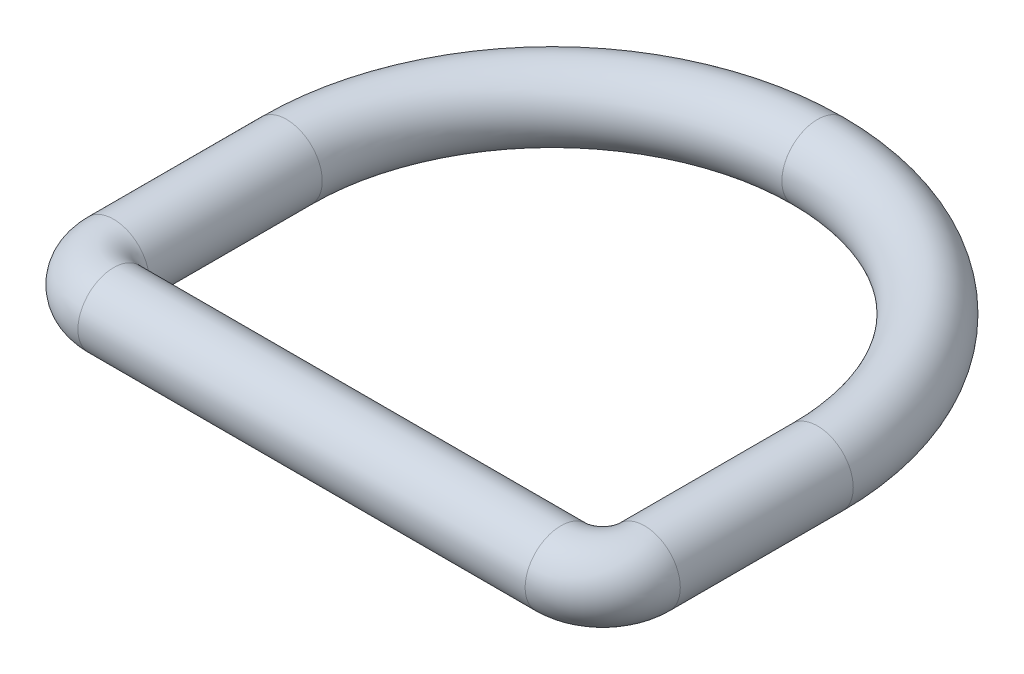
ISO-10303-21;
HEADER;
FILE_DESCRIPTION(('STEP AP214'),'2;1');
FILE_NAME('part.step','',(''),(''),'','','');
FILE_SCHEMA(('AUTOMOTIVE_DESIGN { 1 0 10303 214 1 1 1 1 }'));
ENDSEC;
DATA;
#1=APPLICATION_CONTEXT('core data for automotive mechanical design processes');
#2=APPLICATION_PROTOCOL_DEFINITION('international standard','automotive_design',2000,#1);
#3=PRODUCT_CONTEXT('',#1,'mechanical');
#4=PRODUCT('Part','Part','',(#3));
#5=PRODUCT_RELATED_PRODUCT_CATEGORY('part','',(#4));
#6=PRODUCT_DEFINITION_FORMATION('','',#4);
#7=PRODUCT_DEFINITION_CONTEXT('part definition',#1,'design');
#8=PRODUCT_DEFINITION('design','',#6,#7);
#9=PRODUCT_DEFINITION_SHAPE('','',#8);
#10=(LENGTH_UNIT() NAMED_UNIT(*) SI_UNIT(.MILLI.,.METRE.));
#11=(NAMED_UNIT(*) PLANE_ANGLE_UNIT() SI_UNIT($,.RADIAN.));
#12=(NAMED_UNIT(*) SI_UNIT($,.STERADIAN.) SOLID_ANGLE_UNIT());
#13=UNCERTAINTY_MEASURE_WITH_UNIT(LENGTH_MEASURE(1.E-05),#10,'distance_accuracy_value','');
#14=(GEOMETRIC_REPRESENTATION_CONTEXT(3) GLOBAL_UNCERTAINTY_ASSIGNED_CONTEXT((#13)) GLOBAL_UNIT_ASSIGNED_CONTEXT((#10,
#11,#12)) REPRESENTATION_CONTEXT('',''));
#15=CARTESIAN_POINT('',(0.,0.,0.));
#16=DIRECTION('',(0.,0.,1.));
#17=DIRECTION('',(1.,0.,0.));
#18=AXIS2_PLACEMENT_3D('',#15,#16,#17);
#19=CARTESIAN_POINT('',(-3.40836581343383,-9.71495477391288,-11.6115349304083));
#20=DIRECTION('',(0.,-1.,0.));
#21=DIRECTION('',(0.,0.,-1.));
#22=AXIS2_PLACEMENT_3D('',#19,#20,#21);
#23=TOROIDAL_SURFACE('',#22,3.175,2.7051);
#24=CARTESIAN_POINT('',(-0.233365813433827,-9.71495477391288,-11.6115349304083));
#25=DIRECTION('',(0.,0.,-1.));
#26=DIRECTION('',(-1.,0.,0.));
#27=AXIS2_PLACEMENT_3D('',#24,#25,#26);
#28=CIRCLE('',#27,2.7051);
#29=CARTESIAN_POINT('',(2.47173418656617,-9.71495477391288,-11.6115349304083));
#30=VERTEX_POINT('',#29);
#31=EDGE_CURVE('E24',#30,#30,#28,.T.);
#32=ORIENTED_EDGE('',*,*,#31,.F.);
#33=EDGE_LOOP('',(#32));
#34=FACE_BOUND('',#33,.T.);
#35=CARTESIAN_POINT('',(-3.40836581343383,-9.71495477391288,-11.1416349304083));
#36=CARTESIAN_POINT('',(-3.40836581343383,-9.67069263396935,-11.1416358693182));
#37=CARTESIAN_POINT('',(-3.40836581343383,-9.62643057391784,-11.1405486085736));
#38=CARTESIAN_POINT('',(-3.40836581343383,-9.53801304226172,-11.1362044294043));
#39=CARTESIAN_POINT('',(-3.40836581343383,-9.49385757065712,-11.1329475109796));
#40=CARTESIAN_POINT('',(-3.40836581343383,-9.40575964455766,-11.1242707580789));
#41=CARTESIAN_POINT('',(-3.40836581343383,-9.3618171900628,-11.118850923603));
#42=CARTESIAN_POINT('',(-3.40836581343383,-9.27425114486457,-11.1058616914251));
#43=CARTESIAN_POINT('',(-3.40836581343383,-9.23062755416119,-11.0982922937233));
#44=CARTESIAN_POINT('',(-3.40836581343383,-9.14380433349291,-11.0810220911309));
#45=CARTESIAN_POINT('',(-3.40836581343384,-9.100604703528,-11.0713212862405));
#46=CARTESIAN_POINT('',(-3.40836581343384,-9.01473347498513,-11.0498116606093));
#47=CARTESIAN_POINT('',(-3.40836581343384,-8.97206187640717,-11.0380028398686));
#48=CARTESIAN_POINT('',(-3.40836581343384,-8.8873495105365,-11.0123056253265));
#49=CARTESIAN_POINT('',(-3.40836581343384,-8.84530874324378,-10.9984172315251));
#50=CARTESIAN_POINT('',(-3.40836581343384,-8.76195931975939,-10.9685943307447));
#51=CARTESIAN_POINT('',(-3.40836581343384,-8.72065066356771,-10.9526598237655));
#52=CARTESIAN_POINT('',(-3.40836581343384,-8.63886497847644,-10.9187830838437));
#53=CARTESIAN_POINT('',(-3.40836581343384,-8.59838794957686,-10.9008408509009));
#54=CARTESIAN_POINT('',(-3.40836581343384,-8.51836303177239,-10.8629918835722));
#55=CARTESIAN_POINT('',(-3.40836581343384,-8.47881514286751,-10.8430851491861));
#56=CARTESIAN_POINT('',(-3.40836581343384,-8.40074377938224,-10.801355136008));
#57=CARTESIAN_POINT('',(-3.40836581343384,-8.36222030480186,-10.779531857216));
#58=CARTESIAN_POINT('',(-3.40836581343384,-8.28629057638973,-10.7340213294241));
#59=CARTESIAN_POINT('',(-3.40836581343384,-8.24888432255799,-10.7103340804241));
#60=CARTESIAN_POINT('',(-3.40836581343384,-8.17527915058512,-10.6611526768717));
#61=CARTESIAN_POINT('',(-3.40836581343384,-8.139080232444,-10.6356585223193));
#62=CARTESIAN_POINT('',(-3.40836581343384,-8.0679769382168,-10.5829247253139));
#63=CARTESIAN_POINT('',(-3.40836581343384,-8.03307256213072,-10.5556850828609));
#64=CARTESIAN_POINT('',(-3.40836581343384,-7.96464243971288,-10.4995259327388));
#65=CARTESIAN_POINT('',(-3.40836581343385,-7.93111669338111,-10.4706064250697));
#66=CARTESIAN_POINT('',(-3.40836581343385,-7.86552459693131,-10.4111572141424));
#67=CARTESIAN_POINT('',(-3.40836581343385,-7.83345824681327,-10.3806275108842));
#68=CARTESIAN_POINT('',(-3.40836581343385,-7.77086219343703,-10.3180314575079));
#69=CARTESIAN_POINT('',(-3.40836581343385,-7.74033249017884,-10.2859651073899));
#70=CARTESIAN_POINT('',(-3.40836581343385,-7.68088327925152,-10.2203730109401));
#71=CARTESIAN_POINT('',(-3.40836581343385,-7.65196377158241,-10.1868472646083));
#72=CARTESIAN_POINT('',(-3.40836581343385,-7.59580462146027,-10.1184171421905));
#73=CARTESIAN_POINT('',(-3.40836581343385,-7.56856497900726,-10.0835127661044));
#74=CARTESIAN_POINT('',(-3.40836581343385,-7.51583118200192,-10.0124094718772));
#75=CARTESIAN_POINT('',(-3.40836581343385,-7.49033702744958,-9.97621055373607));
#76=CARTESIAN_POINT('',(-3.40836581343385,-7.44115562389695,-9.90260538176322));
#77=CARTESIAN_POINT('',(-3.40836581343386,-7.41746837489664,-9.86519912793149));
#78=CARTESIAN_POINT('',(-3.40836581343386,-7.37195784710565,-9.78926939951932));
#79=CARTESIAN_POINT('',(-3.40836581343386,-7.35013456831497,-9.75074592493887));
#80=CARTESIAN_POINT('',(-3.40836581343386,-7.30840455513332,-9.67267456145378));
#81=CARTESIAN_POINT('',(-3.40836581343386,-7.28849782074237,-9.63312667254914));
#82=CARTESIAN_POINT('',(-3.40836581343386,-7.25064885342694,-9.55310175474401));
#83=CARTESIAN_POINT('',(-3.40836581343386,-7.23270662050248,-9.51262472584353));
#84=CARTESIAN_POINT('',(-3.40836581343386,-7.19882988053072,-9.43083904075472));
#85=CARTESIAN_POINT('',(-3.40836581343386,-7.18289537348342,-9.38953038456639));
#86=CARTESIAN_POINT('',(-3.40836581343387,-7.15307247288916,-9.30618096107284));
#87=CARTESIAN_POINT('',(-3.40836581343387,-7.1391840793422,-9.26414019376763));
#88=CARTESIAN_POINT('',(-3.40836581343387,-7.11348686410516,-9.1794278279311));
#89=CARTESIAN_POINT('',(-3.40836581343387,-7.10167804241508,-9.13675622939978));
#90=CARTESIAN_POINT('',(-3.40836581343387,-7.08016841937756,-9.0508850007295));
#91=CARTESIAN_POINT('',(-3.40836581343387,-7.07046761803013,-9.00768537059053));
#92=CARTESIAN_POINT('',(-3.40836581343387,-7.05319740575807,-8.92086215039777));
#93=CARTESIAN_POINT('',(-3.40836581343387,-7.04562799483343,-8.877238560344));
#94=CARTESIAN_POINT('',(-3.40836581343387,-7.03263879878087,-8.78967251337104));
#95=CARTESIAN_POINT('',(-3.40836581343387,-7.02721901365295,-8.74573005645187));
#96=CARTESIAN_POINT('',(-3.40836581343388,-7.0185421259309,-8.65763213697576));
#97=CARTESIAN_POINT('',(-3.40836581343388,-7.01528502333677,-8.61347667441881));
#98=CARTESIAN_POINT('',(-3.40836581343388,-7.01094134732777,-8.52505911804402));
#99=CARTESIAN_POINT('',(-3.40836581343388,-7.00985477391288,-8.48079702422617));
#100=CARTESIAN_POINT('',(-3.40836581343388,-7.00985477391288,-8.39227283659047));
#101=CARTESIAN_POINT('',(-3.40836581343388,-7.01094134732777,-8.34801074277262));
#102=CARTESIAN_POINT('',(-3.40836581343388,-7.01528502333677,-8.25959318639783));
#103=CARTESIAN_POINT('',(-3.40836581343388,-7.0185421259309,-8.21543772384088));
#104=CARTESIAN_POINT('',(-3.40836581343389,-7.02721901365295,-8.12733980436477));
#105=CARTESIAN_POINT('',(-3.40836581343389,-7.03263879878087,-8.0833973474456));
#106=CARTESIAN_POINT('',(-3.40836581343389,-7.04562799483343,-7.99583130047264));
#107=CARTESIAN_POINT('',(-3.40836581343389,-7.05319740575807,-7.95220771041887));
#108=CARTESIAN_POINT('',(-3.40836581343389,-7.07046761803013,-7.86538449022612));
#109=CARTESIAN_POINT('',(-3.40836581343389,-7.08016841937756,-7.82218486008714));
#110=CARTESIAN_POINT('',(-3.40836581343389,-7.10167804241508,-7.73631363141686));
#111=CARTESIAN_POINT('',(-3.40836581343389,-7.11348686410516,-7.69364203288554));
#112=CARTESIAN_POINT('',(-3.40836581343389,-7.1391840793422,-7.60892966704901));
#113=CARTESIAN_POINT('',(-3.40836581343389,-7.15307247288916,-7.5668888997438));
#114=CARTESIAN_POINT('',(-3.4083658134339,-7.18289537348342,-7.48353947625025));
#115=CARTESIAN_POINT('',(-3.4083658134339,-7.19882988053072,-7.44223082006192));
#116=CARTESIAN_POINT('',(-3.4083658134339,-7.23270662050248,-7.36044513497311));
#117=CARTESIAN_POINT('',(-3.4083658134339,-7.25064885342694,-7.31996810607263));
#118=CARTESIAN_POINT('',(-3.4083658134339,-7.28849782074237,-7.2399431882675));
#119=CARTESIAN_POINT('',(-3.4083658134339,-7.30840455513332,-7.20039529936286));
#120=CARTESIAN_POINT('',(-3.4083658134339,-7.35013456831497,-7.12232393587777));
#121=CARTESIAN_POINT('',(-3.4083658134339,-7.37195784710565,-7.08380046129732));
#122=CARTESIAN_POINT('',(-3.4083658134339,-7.41746837489664,-7.00787073288515));
#123=CARTESIAN_POINT('',(-3.4083658134339,-7.44115562389695,-6.97046447905342));
#124=CARTESIAN_POINT('',(-3.4083658134339,-7.49033702744959,-6.89685930708057));
#125=CARTESIAN_POINT('',(-3.40836581343391,-7.51583118200192,-6.86066038893944));
#126=CARTESIAN_POINT('',(-3.40836581343391,-7.56856497900726,-6.78955709471224));
#127=CARTESIAN_POINT('',(-3.40836581343391,-7.59580462146028,-6.75465271862616));
#128=CARTESIAN_POINT('',(-3.40836581343391,-7.65196377158241,-6.68622259620832));
#129=CARTESIAN_POINT('',(-3.40836581343391,-7.68088327925152,-6.65269684987655));
#130=CARTESIAN_POINT('',(-3.40836581343391,-7.74033249017884,-6.58710475342675));
#131=CARTESIAN_POINT('',(-3.40836581343391,-7.77086219343703,-6.55503840330871));
#132=CARTESIAN_POINT('',(-3.40836581343391,-7.83345824681327,-6.49244234993247));
#133=CARTESIAN_POINT('',(-3.40836581343391,-7.86552459693131,-6.46191264667428));
#134=CARTESIAN_POINT('',(-3.40836581343391,-7.93111669338111,-6.40246343574696));
#135=CARTESIAN_POINT('',(-3.40836581343392,-7.96464243971288,-6.37354392807785));
#136=CARTESIAN_POINT('',(-3.40836581343392,-8.03307256213072,-6.31738477795572));
#137=CARTESIAN_POINT('',(-3.40836581343392,-8.0679769382168,-6.2901451355027));
#138=CARTESIAN_POINT('',(-3.40836581343392,-8.139080232444,-6.23741133849736));
#139=CARTESIAN_POINT('',(-3.40836581343392,-8.17527915058513,-6.21191718394502));
#140=CARTESIAN_POINT('',(-3.40836581343392,-8.24888432255798,-6.16273578039239));
#141=CARTESIAN_POINT('',(-3.40836581343392,-8.28629057638971,-6.13904853139208));
#142=CARTESIAN_POINT('',(-3.40836581343392,-8.36222030480188,-6.09353800360109));
#143=CARTESIAN_POINT('',(-3.40836581343392,-8.40074377938233,-6.07171472481041));
#144=CARTESIAN_POINT('',(-3.40836581343392,-8.47881514286742,-6.02998471162876));
#145=CARTESIAN_POINT('',(-3.40836581343392,-8.51836303177206,-6.0100779772378));
#146=CARTESIAN_POINT('',(-3.40836581343392,-8.59838794957719,-5.97222900992238));
#147=CARTESIAN_POINT('',(-3.40836581343392,-8.63886497847767,-5.95428677699792));
#148=CARTESIAN_POINT('',(-3.40836581343392,-8.72065066356648,-5.92041003702616));
#149=CARTESIAN_POINT('',(-3.40836581343392,-8.76195931975482,-5.90447552997886));
#150=CARTESIAN_POINT('',(-3.40836581343392,-8.84530874324836,-5.8746526293846));
#151=CARTESIAN_POINT('',(-3.40836581343392,-8.88734951055357,-5.86076423583764));
#152=CARTESIAN_POINT('',(-3.40836581343393,-8.9720618763901,-5.8350670206006));
#153=CARTESIAN_POINT('',(-3.40836581343393,-9.01473347492142,-5.82325819891052));
#154=CARTESIAN_POINT('',(-3.40836581343393,-9.10060470359171,-5.801748575873));
#155=CARTESIAN_POINT('',(-3.40836581343393,-9.14380433373068,-5.79204777452557));
#156=CARTESIAN_POINT('',(-3.40836581343393,-9.23062755392343,-5.77477756225351));
#157=CARTESIAN_POINT('',(-3.40836581343393,-9.27425114397721,-5.76720815132887));
#158=CARTESIAN_POINT('',(-3.40836581343393,-9.36181719095016,-5.75421895527631));
#159=CARTESIAN_POINT('',(-3.40836581343393,-9.40575964786933,-5.74879917014839));
#160=CARTESIAN_POINT('',(-3.40836581343393,-9.49385756734544,-5.74012228242634));
#161=CARTESIAN_POINT('',(-3.40836581343393,-9.53801302990239,-5.73686517983221));
#162=CARTESIAN_POINT('',(-3.40836581343393,-9.62643058627718,-5.7325215038232));
#163=CARTESIAN_POINT('',(-3.40836581343393,-9.67069268009503,-5.73143493040832));
#164=CARTESIAN_POINT('',(-3.40836581343393,-9.75921686773073,-5.73143493040832));
#165=CARTESIAN_POINT('',(-3.40836581343393,-9.80347896154858,-5.7325215038232));
#166=CARTESIAN_POINT('',(-3.40836581343393,-9.89189651792338,-5.73686517983221));
#167=CARTESIAN_POINT('',(-3.40836581343393,-9.93605198048032,-5.74012228242634));
#168=CARTESIAN_POINT('',(-3.40836581343393,-10.0241498999564,-5.74879917014839));
#169=CARTESIAN_POINT('',(-3.40836581343393,-10.0680923568756,-5.75421895527631));
#170=CARTESIAN_POINT('',(-3.40836581343393,-10.1556584038486,-5.76720815132887));
#171=CARTESIAN_POINT('',(-3.40836581343393,-10.1992819939023,-5.77477756225351));
#172=CARTESIAN_POINT('',(-3.40836581343393,-10.2861052140951,-5.79204777452557));
#173=CARTESIAN_POINT('',(-3.40836581343393,-10.3293048442341,-5.801748575873));
#174=CARTESIAN_POINT('',(-3.40836581343393,-10.4151760729043,-5.82325819891052));
#175=CARTESIAN_POINT('',(-3.40836581343393,-10.4578476714357,-5.8350670206006));
#176=CARTESIAN_POINT('',(-3.40836581343392,-10.5425600372722,-5.86076423583764));
#177=CARTESIAN_POINT('',(-3.40836581343392,-10.5846008045774,-5.8746526293846));
#178=CARTESIAN_POINT('',(-3.40836581343392,-10.6679502280709,-5.90447552997886));
#179=CARTESIAN_POINT('',(-3.40836581343392,-10.7092588842593,-5.92041003702616));
#180=CARTESIAN_POINT('',(-3.40836581343392,-10.7910445693481,-5.95428677699792));
#181=CARTESIAN_POINT('',(-3.40836581343392,-10.8315215982486,-5.97222900992238));
#182=CARTESIAN_POINT('',(-3.40836581343392,-10.9115465160537,-6.0100779772378));
#183=CARTESIAN_POINT('',(-3.40836581343392,-10.9510944049583,-6.02998471162876));
#184=CARTESIAN_POINT('',(-3.40836581343392,-11.0291657684434,-6.07171472481041));
#185=CARTESIAN_POINT('',(-3.40836581343392,-11.0676892430239,-6.09353800360109));
#186=CARTESIAN_POINT('',(-3.40836581343392,-11.1436189714361,-6.13904853139208));
#187=CARTESIAN_POINT('',(-3.40836581343392,-11.1810252252678,-6.16273578039239));
#188=CARTESIAN_POINT('',(-3.40836581343392,-11.2546303972406,-6.21191718394502));
#189=CARTESIAN_POINT('',(-3.40836581343392,-11.2908293153818,-6.23741133849736));
#190=CARTESIAN_POINT('',(-3.40836581343392,-11.361932609609,-6.2901451355027));
#191=CARTESIAN_POINT('',(-3.40836581343392,-11.396836985695,-6.31738477795572));
#192=CARTESIAN_POINT('',(-3.40836581343392,-11.4652671081129,-6.37354392807785));
#193=CARTESIAN_POINT('',(-3.40836581343391,-11.4987928544446,-6.40246343574696));
#194=CARTESIAN_POINT('',(-3.40836581343391,-11.5643849508945,-6.46191264667428));
#195=CARTESIAN_POINT('',(-3.40836581343391,-11.5964513010125,-6.49244234993247));
#196=CARTESIAN_POINT('',(-3.40836581343391,-11.6590473543887,-6.55503840330871));
#197=CARTESIAN_POINT('',(-3.40836581343391,-11.6895770576469,-6.58710475342675));
#198=CARTESIAN_POINT('',(-3.40836581343391,-11.7490262685742,-6.65269684987655));
#199=CARTESIAN_POINT('',(-3.40836581343391,-11.7779457762434,-6.68622259620832));
#200=CARTESIAN_POINT('',(-3.40836581343391,-11.8341049263655,-6.75465271862616));
#201=CARTESIAN_POINT('',(-3.40836581343391,-11.8613445688185,-6.78955709471224));
#202=CARTESIAN_POINT('',(-3.40836581343391,-11.9140783658238,-6.86066038893944));
#203=CARTESIAN_POINT('',(-3.4083658134339,-11.9395725203762,-6.89685930708057));
#204=CARTESIAN_POINT('',(-3.4083658134339,-11.9887539239288,-6.97046447905342));
#205=CARTESIAN_POINT('',(-3.4083658134339,-12.0124411729291,-7.00787073288515));
#206=CARTESIAN_POINT('',(-3.4083658134339,-12.0579517007201,-7.08380046129732));
#207=CARTESIAN_POINT('',(-3.4083658134339,-12.0797749795108,-7.12232393587777));
#208=CARTESIAN_POINT('',(-3.4083658134339,-12.1215049926924,-7.20039529936286));
#209=CARTESIAN_POINT('',(-3.4083658134339,-12.1414117270834,-7.2399431882675));
#210=CARTESIAN_POINT('',(-3.4083658134339,-12.1792606943988,-7.31996810607263));
#211=CARTESIAN_POINT('',(-3.4083658134339,-12.1972029273233,-7.36044513497311));
#212=CARTESIAN_POINT('',(-3.4083658134339,-12.231079667295,-7.44223082006192));
#213=CARTESIAN_POINT('',(-3.4083658134339,-12.2470141743423,-7.48353947625025));
#214=CARTESIAN_POINT('',(-3.40836581343389,-12.2768370749366,-7.5668888997438));
#215=CARTESIAN_POINT('',(-3.40836581343389,-12.2907254684836,-7.60892966704901));
#216=CARTESIAN_POINT('',(-3.40836581343389,-12.3164226837206,-7.69364203288554));
#217=CARTESIAN_POINT('',(-3.40836581343389,-12.3282315054107,-7.73631363141686));
#218=CARTESIAN_POINT('',(-3.40836581343389,-12.3497411284482,-7.82218486008714));
#219=CARTESIAN_POINT('',(-3.40836581343389,-12.3594419297956,-7.86538449022612));
#220=CARTESIAN_POINT('',(-3.40836581343389,-12.3767121420677,-7.95220771041887));
#221=CARTESIAN_POINT('',(-3.40836581343389,-12.3842815529923,-7.99583130047264));
#222=CARTESIAN_POINT('',(-3.40836581343389,-12.3972707490449,-8.0833973474456));
#223=CARTESIAN_POINT('',(-3.40836581343389,-12.4026905341728,-8.12733980436477));
#224=CARTESIAN_POINT('',(-3.40836581343388,-12.4113674218949,-8.21543772384088));
#225=CARTESIAN_POINT('',(-3.40836581343388,-12.414624524489,-8.25959318639783));
#226=CARTESIAN_POINT('',(-3.40836581343388,-12.418968200498,-8.34801074277262));
#227=CARTESIAN_POINT('',(-3.40836581343388,-12.4200547739129,-8.39227283659047));
#228=CARTESIAN_POINT('',(-3.40836581343388,-12.4200547739129,-8.48079702422617));
#229=CARTESIAN_POINT('',(-3.40836581343388,-12.418968200498,-8.52505911804402));
#230=CARTESIAN_POINT('',(-3.40836581343388,-12.414624524489,-8.61347667441881));
#231=CARTESIAN_POINT('',(-3.40836581343388,-12.4113674218949,-8.65763213697576));
#232=CARTESIAN_POINT('',(-3.40836581343387,-12.4026905341728,-8.74573005645187));
#233=CARTESIAN_POINT('',(-3.40836581343387,-12.3972707490449,-8.78967251337104));
#234=CARTESIAN_POINT('',(-3.40836581343387,-12.3842815529923,-8.877238560344));
#235=CARTESIAN_POINT('',(-3.40836581343387,-12.3767121420677,-8.92086215039777));
#236=CARTESIAN_POINT('',(-3.40836581343387,-12.3594419297956,-9.00768537059053));
#237=CARTESIAN_POINT('',(-3.40836581343387,-12.3497411284482,-9.0508850007295));
#238=CARTESIAN_POINT('',(-3.40836581343387,-12.3282315054107,-9.13675622939978));
#239=CARTESIAN_POINT('',(-3.40836581343387,-12.3164226837206,-9.1794278279311));
#240=CARTESIAN_POINT('',(-3.40836581343387,-12.2907254684836,-9.26414019376763));
#241=CARTESIAN_POINT('',(-3.40836581343387,-12.2768370749366,-9.30618096107284));
#242=CARTESIAN_POINT('',(-3.40836581343386,-12.2470141743423,-9.38953038456639));
#243=CARTESIAN_POINT('',(-3.40836581343386,-12.231079667295,-9.43083904075472));
#244=CARTESIAN_POINT('',(-3.40836581343386,-12.1972029273233,-9.51262472584353));
#245=CARTESIAN_POINT('',(-3.40836581343386,-12.1792606943988,-9.55310175474401));
#246=CARTESIAN_POINT('',(-3.40836581343386,-12.1414117270834,-9.63312667254914));
#247=CARTESIAN_POINT('',(-3.40836581343386,-12.1215049926924,-9.67267456145378));
#248=CARTESIAN_POINT('',(-3.40836581343386,-12.0797749795108,-9.75074592493887));
#249=CARTESIAN_POINT('',(-3.40836581343386,-12.0579517007201,-9.78926939951932));
#250=CARTESIAN_POINT('',(-3.40836581343386,-12.0124411729291,-9.86519912793149));
#251=CARTESIAN_POINT('',(-3.40836581343385,-11.9887539239288,-9.90260538176322));
#252=CARTESIAN_POINT('',(-3.40836581343385,-11.9395725203762,-9.97621055373607));
#253=CARTESIAN_POINT('',(-3.40836581343385,-11.9140783658238,-10.0124094718772));
#254=CARTESIAN_POINT('',(-3.40836581343385,-11.8613445688185,-10.0835127661044));
#255=CARTESIAN_POINT('',(-3.40836581343385,-11.8341049263655,-10.1184171421905));
#256=CARTESIAN_POINT('',(-3.40836581343385,-11.7779457762434,-10.1868472646083));
#257=CARTESIAN_POINT('',(-3.40836581343385,-11.7490262685742,-10.2203730109401));
#258=CARTESIAN_POINT('',(-3.40836581343385,-11.6895770576469,-10.2859651073899));
#259=CARTESIAN_POINT('',(-3.40836581343385,-11.6590473543887,-10.3180314575079));
#260=CARTESIAN_POINT('',(-3.40836581343385,-11.5964513010125,-10.3806275108842));
#261=CARTESIAN_POINT('',(-3.40836581343385,-11.5643849508945,-10.4111572141424));
#262=CARTESIAN_POINT('',(-3.40836581343385,-11.4987928544446,-10.4706064250697));
#263=CARTESIAN_POINT('',(-3.40836581343384,-11.4652671081129,-10.4995259327388));
#264=CARTESIAN_POINT('',(-3.40836581343384,-11.396836985695,-10.5556850828609));
#265=CARTESIAN_POINT('',(-3.40836581343384,-11.361932609609,-10.5829247253139));
#266=CARTESIAN_POINT('',(-3.40836581343384,-11.2908293153818,-10.6356585223193));
#267=CARTESIAN_POINT('',(-3.40836581343384,-11.2546303972406,-10.6611526768717));
#268=CARTESIAN_POINT('',(-3.40836581343384,-11.1810252252678,-10.7103340804241));
#269=CARTESIAN_POINT('',(-3.40836581343384,-11.143618971436,-10.7340213294241));
#270=CARTESIAN_POINT('',(-3.40836581343384,-11.0676892430239,-10.779531857216));
#271=CARTESIAN_POINT('',(-3.40836581343384,-11.0291657684435,-10.801355136008));
#272=CARTESIAN_POINT('',(-3.40836581343384,-10.9510944049583,-10.8430851491861));
#273=CARTESIAN_POINT('',(-3.40836581343384,-10.9115465160534,-10.8629918835722));
#274=CARTESIAN_POINT('',(-3.40836581343384,-10.8315215982489,-10.9008408509009));
#275=CARTESIAN_POINT('',(-3.40836581343384,-10.7910445693493,-10.9187830838437));
#276=CARTESIAN_POINT('',(-3.40836581343384,-10.7092588842581,-10.9526598237655));
#277=CARTESIAN_POINT('',(-3.40836581343384,-10.6679502280664,-10.9685943307447));
#278=CARTESIAN_POINT('',(-3.40836581343384,-10.584600804582,-10.9984172315251));
#279=CARTESIAN_POINT('',(-3.40836581343384,-10.5425600372893,-11.0123056253265));
#280=CARTESIAN_POINT('',(-3.40836581343384,-10.4578476714186,-11.0380028398686));
#281=CARTESIAN_POINT('',(-3.40836581343384,-10.4151760728406,-11.0498116606093));
#282=CARTESIAN_POINT('',(-3.40836581343384,-10.3293048442978,-11.0713212862405));
#283=CARTESIAN_POINT('',(-3.40836581343383,-10.2861052143329,-11.0810220911309));
#284=CARTESIAN_POINT('',(-3.40836581343383,-10.1992819936646,-11.0982922937233));
#285=CARTESIAN_POINT('',(-3.40836581343383,-10.1556584029612,-11.1058616914251));
#286=CARTESIAN_POINT('',(-3.40836581343383,-10.068092357763,-11.118850923603));
#287=CARTESIAN_POINT('',(-3.40836581343383,-10.0241499032681,-11.1242707580789));
#288=CARTESIAN_POINT('',(-3.40836581343383,-9.93605197716864,-11.1329475109796));
#289=CARTESIAN_POINT('',(-3.40836581343383,-9.89189650556404,-11.1362044294043));
#290=CARTESIAN_POINT('',(-3.40836581343383,-9.80347897390792,-11.1405486085736));
#291=CARTESIAN_POINT('',(-3.40836581343383,-9.75921691385641,-11.1416358693182));
#292=CARTESIAN_POINT('',(-3.40836581343383,-9.71495477391288,-11.1416349304083));
#293=B_SPLINE_CURVE_WITH_KNOTS('',3,(#35,#36,#37,#38,#39,#40,#41,#42,#43,#44,#45,#46,#47,#48,
#49,#50,#51,#52,#53,#54,#55,#56,#57,#58,#59,#60,#61,#62,#63,#64,#65,#66,#67,#68,#69,#70,#71,#72,
#73,#74,#75,#76,#77,#78,#79,#80,#81,#82,#83,#84,#85,#86,#87,#88,#89,#90,#91,#92,#93,#94,#95,#96,
#97,#98,#99,#100,#101,#102,#103,#104,#105,#106,#107,#108,#109,#110,#111,#112,#113,#114,#115,
#116,#117,#118,#119,#120,#121,#122,#123,#124,#125,#126,#127,#128,#129,#130,#131,#132,#133,#134,
#135,#136,#137,#138,#139,#140,#141,#142,#143,#144,#145,#146,#147,#148,#149,#150,#151,#152,#153,
#154,#155,#156,#157,#158,#159,#160,#161,#162,#163,#164,#165,#166,#167,#168,#169,#170,#171,#172,
#173,#174,#175,#176,#177,#178,#179,#180,#181,#182,#183,#184,#185,#186,#187,#188,#189,#190,#191,
#192,#193,#194,#195,#196,#197,#198,#199,#200,#201,#202,#203,#204,#205,#206,#207,#208,#209,#210,
#211,#212,#213,#214,#215,#216,#217,#218,#219,#220,#221,#222,#223,#224,#225,#226,#227,#228,#229,
#230,#231,#232,#233,#234,#235,#236,#237,#238,#239,#240,#241,#242,#243,#244,#245,#246,#247,#248,
#249,#250,#251,#252,#253,#254,#255,#256,#257,#258,#259,#260,#261,#262,#263,#264,#265,#266,#267,
#268,#269,#270,#271,#272,#273,#274,#275,#276,#277,#278,#279,#280,#281,#282,#283,#284,#285,#286,
#287,#288,#289,#290,#291,#292),.UNSPECIFIED.,.F.,.F.,(4,2,2,2,2,2,2,2,2,2,2,2,2,2,2,2,2,2,2,2,2,
2,2,2,2,2,2,2,2,2,2,2,2,2,2,2,2,2,2,2,2,2,2,2,2,2,2,2,2,2,2,2,2,2,2,2,2,2,2,2,2,2,2,2,2,2,2,2,2,
2,2,2,2,2,2,2,2,2,2,2,2,2,2,2,2,2,2,2,2,2,2,2,2,2,2,2,2,2,2,2,2,2,2,2,2,2,2,2,2,2,2,2,2,2,2,2,2,
2,2,2,2,2,2,2,2,2,2,2,4),(0.,0.13277295455466,0.26554590910932,0.398318863663981,
0.531091818218641,0.663864772773301,0.79663772732796,0.92941068188262,1.06218363643728,
1.19495659099194,1.3277295455466,1.46050250010126,1.59327545465592,1.72604840921058,
1.85882136376524,1.9915943183199,2.12436727287456,2.25714022742922,2.38991318198388,
2.52268613653854,2.6554590910932,2.78823204564786,2.92100500020252,3.05377795475718,
3.18655090931184,3.3193238638665,3.45209681842116,3.58486977297582,3.71764272753048,
3.85041568208514,3.9831886366398,4.11596159119446,4.24873454574912,4.38150750030378,
4.51428045485844,4.6470534094131,4.77982636396776,4.91259931852242,5.04537227307708,
5.17814522763174,5.3109181821864,5.44369113674106,5.57646409129572,5.70923704585038,
5.84201000040504,5.9747829549597,6.10755590951436,6.24032886406902,6.37310181862368,
6.50587477317834,6.638647727733,6.77142068228766,6.90419363684232,7.03696659139698,
7.16973954595164,7.3025125005063,7.43528545506096,7.56805840961562,7.70083136417028,
7.83360431872494,7.9663772732796,8.09915022783426,8.23192318238892,8.36469613694358,
8.49746909149824,8.6302420460529,8.76301500060756,8.89578795516222,9.02856090971689,
9.16133386427155,9.2941068188262,9.42687977338086,9.55965272793553,9.69242568249019,
9.82519863704485,9.95797159159951,10.0907445461542,10.2235175007088,10.3562904552635,
10.4890634098181,10.6218363643728,10.7546093189275,10.8873822734821,11.0201552280368,
11.1529281825914,11.2857011371461,11.4184740917008,11.5512470462554,11.6840200008101,
11.8167929553647,11.9495659099194,12.0823388644741,12.2151118190287,12.3478847735834,
12.480657728138,12.6134306826927,12.7462036372474,12.878976591802,13.0117495463567,
13.1445225009113,13.277295455466,13.4100684100207,13.5428413645753,13.67561431913,
13.8083872736846,13.9411602282393,14.073933182794,14.2067061373486,14.3394790919033,
14.4722520464579,14.6050250010126,14.7377979555673,14.8705709101219,15.0033438646766,
15.1361168192312,15.2688897737859,15.4016627283406,15.5344356828952,15.6672086374499,
15.7999815920046,15.9327545465592,16.0655275011139,16.1983004556685,16.3310734102232,
16.4638463647779,16.5966193193325,16.7293922738872,16.8621652284418,16.9949381829965),.UNSPECIFIED.);
#294=CARTESIAN_POINT('',(-3.40836581343383,-9.71495477391288,-11.1416349304083));
#295=VERTEX_POINT('',#294);
#296=EDGE_CURVE('E10',#295,#295,#293,.T.);
#297=ORIENTED_EDGE('',*,*,#296,.T.);
#298=EDGE_LOOP('',(#297));
#299=FACE_BOUND('',#298,.T.);
#300=ADVANCED_FACE('F14',(#34,#299),#23,.T.);
#301=CARTESIAN_POINT('',(-0.233365813433825,-9.71495477391288,-24.7192049304082));
#302=DIRECTION('',(0.,0.,1.));
#303=DIRECTION('',(1.,0.,0.));
#304=AXIS2_PLACEMENT_3D('',#301,#302,#303);
#305=CYLINDRICAL_SURFACE('',#304,2.7051);
#306=CARTESIAN_POINT('',(-0.233365813433825,-9.71495477391288,-24.7192049304082));
#307=DIRECTION('',(0.,0.,-1.));
#308=DIRECTION('',(-1.,0.,0.));
#309=AXIS2_PLACEMENT_3D('',#306,#307,#308);
#310=CIRCLE('',#309,2.7051);
#311=CARTESIAN_POINT('',(2.47173418656618,-9.71495477391288,-24.7192049304081));
#312=VERTEX_POINT('',#311);
#313=EDGE_CURVE('E29',#312,#312,#310,.T.);
#314=CARTESIAN_POINT('',(2.47173418656618,-9.71495477391288,-24.7192049304081));
#315=CARTESIAN_POINT('',(2.47173418656618,-9.71495477391288,-24.5826667012414));
#316=CARTESIAN_POINT('',(2.47173418656618,-9.71495477391288,-24.4461284720748));
#317=CARTESIAN_POINT('',(2.47173418656618,-9.71495477391288,-24.1730520137414));
#318=CARTESIAN_POINT('',(2.47173418656618,-9.71495477391288,-24.0365137845748));
#319=CARTESIAN_POINT('',(2.47173418656618,-9.71495477391288,-23.7634373262414));
#320=CARTESIAN_POINT('',(2.47173418656618,-9.71495477391288,-23.6268990970748));
#321=CARTESIAN_POINT('',(2.47173418656618,-9.71495477391288,-23.3538226387414));
#322=CARTESIAN_POINT('',(2.47173418656618,-9.71495477391288,-23.2172844095748));
#323=CARTESIAN_POINT('',(2.47173418656618,-9.71495477391288,-22.9442079512414));
#324=CARTESIAN_POINT('',(2.47173418656618,-9.71495477391288,-22.8076697220748));
#325=CARTESIAN_POINT('',(2.47173418656618,-9.71495477391288,-22.5345932637415));
#326=CARTESIAN_POINT('',(2.47173418656618,-9.71495477391288,-22.3980550345748));
#327=CARTESIAN_POINT('',(2.47173418656618,-9.71495477391288,-22.1249785762415));
#328=CARTESIAN_POINT('',(2.47173418656618,-9.71495477391288,-21.9884403470748));
#329=CARTESIAN_POINT('',(2.47173418656618,-9.71495477391288,-21.7153638887415));
#330=CARTESIAN_POINT('',(2.47173418656618,-9.71495477391288,-21.5788256595748));
#331=CARTESIAN_POINT('',(2.47173418656618,-9.71495477391288,-21.3057492012415));
#332=CARTESIAN_POINT('',(2.47173418656618,-9.71495477391288,-21.1692109720748));
#333=CARTESIAN_POINT('',(2.47173418656618,-9.71495477391288,-20.8961345137415));
#334=CARTESIAN_POINT('',(2.47173418656618,-9.71495477391288,-20.7595962845748));
#335=CARTESIAN_POINT('',(2.47173418656618,-9.71495477391288,-20.4865198262415));
#336=CARTESIAN_POINT('',(2.47173418656618,-9.71495477391288,-20.3499815970748));
#337=CARTESIAN_POINT('',(2.47173418656618,-9.71495477391288,-20.0769051387415));
#338=CARTESIAN_POINT('',(2.47173418656617,-9.71495477391288,-19.9403669095748));
#339=CARTESIAN_POINT('',(2.47173418656617,-9.71495477391288,-19.6672904512415));
#340=CARTESIAN_POINT('',(2.47173418656617,-9.71495477391288,-19.5307522220748));
#341=CARTESIAN_POINT('',(2.47173418656617,-9.71495477391288,-19.2576757637415));
#342=CARTESIAN_POINT('',(2.47173418656617,-9.71495477391288,-19.1211375345748));
#343=CARTESIAN_POINT('',(2.47173418656617,-9.71495477391288,-18.8480610762415));
#344=CARTESIAN_POINT('',(2.47173418656617,-9.71495477391288,-18.7115228470748));
#345=CARTESIAN_POINT('',(2.47173418656617,-9.71495477391288,-18.4384463887415));
#346=CARTESIAN_POINT('',(2.47173418656617,-9.71495477391288,-18.3019081595748));
#347=CARTESIAN_POINT('',(2.47173418656617,-9.71495477391288,-18.0288317012415));
#348=CARTESIAN_POINT('',(2.47173418656617,-9.71495477391288,-17.8922934720748));
#349=CARTESIAN_POINT('',(2.47173418656617,-9.71495477391288,-17.6192170137415));
#350=CARTESIAN_POINT('',(2.47173418656617,-9.71495477391288,-17.4826787845748));
#351=CARTESIAN_POINT('',(2.47173418656617,-9.71495477391288,-17.2096023262415));
#352=CARTESIAN_POINT('',(2.47173418656617,-9.71495477391288,-17.0730640970749));
#353=CARTESIAN_POINT('',(2.47173418656617,-9.71495477391288,-16.7999876387415));
#354=CARTESIAN_POINT('',(2.47173418656617,-9.71495477391288,-16.6634494095749));
#355=CARTESIAN_POINT('',(2.47173418656617,-9.71495477391288,-16.3903729512415));
#356=CARTESIAN_POINT('',(2.47173418656617,-9.71495477391288,-16.2538347220749));
#357=CARTESIAN_POINT('',(2.47173418656617,-9.71495477391288,-15.9807582637415));
#358=CARTESIAN_POINT('',(2.47173418656617,-9.71495477391288,-15.8442200345749));
#359=CARTESIAN_POINT('',(2.47173418656617,-9.71495477391288,-15.5711435762415));
#360=CARTESIAN_POINT('',(2.47173418656617,-9.71495477391288,-15.4346053470749));
#361=CARTESIAN_POINT('',(2.47173418656617,-9.71495477391288,-15.1615288887415));
#362=CARTESIAN_POINT('',(2.47173418656617,-9.71495477391288,-15.0249906595749));
#363=CARTESIAN_POINT('',(2.47173418656617,-9.71495477391288,-14.7519142012415));
#364=CARTESIAN_POINT('',(2.47173418656617,-9.71495477391288,-14.6153759720749));
#365=CARTESIAN_POINT('',(2.47173418656617,-9.71495477391288,-14.3422995137416));
#366=CARTESIAN_POINT('',(2.47173418656617,-9.71495477391288,-14.2057612845749));
#367=CARTESIAN_POINT('',(2.47173418656617,-9.71495477391288,-13.9326848262416));
#368=CARTESIAN_POINT('',(2.47173418656617,-9.71495477391288,-13.7961465970749));
#369=CARTESIAN_POINT('',(2.47173418656617,-9.71495477391288,-13.5230701387416));
#370=CARTESIAN_POINT('',(2.47173418656617,-9.71495477391288,-13.3865319095749));
#371=CARTESIAN_POINT('',(2.47173418656617,-9.71495477391288,-13.1134554512416));
#372=CARTESIAN_POINT('',(2.47173418656617,-9.71495477391288,-12.9769172220749));
#373=CARTESIAN_POINT('',(2.47173418656617,-9.71495477391288,-12.7038407637416));
#374=CARTESIAN_POINT('',(2.47173418656617,-9.71495477391288,-12.5673025345749));
#375=CARTESIAN_POINT('',(2.47173418656617,-9.71495477391288,-12.2942260762416));
#376=CARTESIAN_POINT('',(2.47173418656617,-9.71495477391288,-12.1576878470749));
#377=CARTESIAN_POINT('',(2.47173418656617,-9.71495477391288,-11.8846113887416));
#378=CARTESIAN_POINT('',(2.47173418656617,-9.71495477391288,-11.7480731595749));
#379=CARTESIAN_POINT('',(2.47173418656617,-9.71495477391288,-11.6115349304083));
#380=B_SPLINE_CURVE_WITH_KNOTS('',3,(#314,#315,#316,#317,#318,#319,#320,#321,#322,#323,#324,
#325,#326,#327,#328,#329,#330,#331,#332,#333,#334,#335,#336,#337,#338,#339,#340,#341,#342,#343,
#344,#345,#346,#347,#348,#349,#350,#351,#352,#353,#354,#355,#356,#357,#358,#359,#360,#361,#362,
#363,#364,#365,#366,#367,#368,#369,#370,#371,#372,#373,#374,#375,#376,#377,#378,#379),
.UNSPECIFIED.,.F.,.F.,(4,2,2,2,2,2,2,2,2,2,2,2,2,2,2,2,2,2,2,2,2,2,2,2,2,2,2,2,2,2,2,2,4),(0.,
0.409614687499997,0.819229374999991,1.22884406249999,1.63845874999998,2.04807343749998,
2.45768812499997,2.86730281249997,3.27691749999996,3.68653218749996,4.09614687499995,
4.50576156249995,4.91537624999994,5.32499093749994,5.73460562499993,6.14422031249993,
6.55383499999992,6.96344968749992,7.37306437499991,7.78267906249991,8.1922937499999,
8.6019084374999,9.01152312499989,9.42113781249989,9.83075249999988,10.2403671874999,
10.6499818749999,11.0595965624999,11.4692112499999,11.8788259374999,12.2884406249999,
12.6980553124998,13.1076699999998),.UNSPECIFIED.);
#381=EDGE_CURVE('BSEAM61',#312,#30,#380,.T.);
#382=ORIENTED_EDGE('',*,*,#313,.F.);
#383=ORIENTED_EDGE('',*,*,#31,.T.);
#384=ORIENTED_EDGE('',*,*,#381,.T.);
#385=ORIENTED_EDGE('',*,*,#381,.F.);
#386=EDGE_LOOP('',(#382,#384,#383,#385));
#387=FACE_BOUND('',#386,.T.);
#388=ADVANCED_FACE('F61',(#387),#305,.T.);
#389=CARTESIAN_POINT('',(-20.3552458134338,-9.71495477391288,-24.7192049304083));
#390=DIRECTION('',(0.,-1.,0.));
#391=DIRECTION('',(0.,0.,-1.));
#392=AXIS2_PLACEMENT_3D('',#389,#390,#391);
#393=TOROIDAL_SURFACE('',#392,20.12188,2.7051);
#394=CARTESIAN_POINT('',(-20.355245813434,-9.71495477391288,-44.8410849304083));
#395=DIRECTION('',(-1.,0.,0.));
#396=DIRECTION('',(0.,0.,1.));
#397=AXIS2_PLACEMENT_3D('',#394,#395,#396);
#398=CIRCLE('',#397,2.7051);
#399=CARTESIAN_POINT('',(-20.355245813434,-9.71495477391288,-47.5461849304083));
#400=VERTEX_POINT('',#399);
#401=EDGE_CURVE('E34',#400,#400,#398,.T.);
#402=CARTESIAN_POINT('',(-20.3552458134338,-9.71495477391288,-24.7192049304083));
#403=DIRECTION('',(0.,-1.,0.));
#404=DIRECTION('',(0.,0.,-1.));
#405=AXIS2_PLACEMENT_3D('',#402,#403,#404);
#406=CIRCLE('',#405,22.82698);
#407=EDGE_CURVE('',#400,#312,#406,.T.);
#408=ORIENTED_EDGE('',*,*,#401,.F.);
#409=ORIENTED_EDGE('',*,*,#313,.T.);
#410=ORIENTED_EDGE('',*,*,#407,.T.);
#411=ORIENTED_EDGE('',*,*,#407,.F.);
#412=EDGE_LOOP('',(#408,#410,#409,#411));
#413=FACE_BOUND('',#412,.T.);
#414=ADVANCED_FACE('F67',(#413),#393,.T.);
#415=CARTESIAN_POINT('',(-20.3577858134337,-9.71495477391288,-44.8410849304083));
#416=DIRECTION('',(1.,0.,0.));
#417=DIRECTION('',(0.,0.,-1.));
#418=AXIS2_PLACEMENT_3D('',#415,#416,#417);
#419=CYLINDRICAL_SURFACE('',#418,2.7051);
#420=CARTESIAN_POINT('',(-20.3577858134337,-9.71495477391288,-44.8410849304083));
#421=DIRECTION('',(-1.,0.,0.));
#422=DIRECTION('',(0.,0.,1.));
#423=AXIS2_PLACEMENT_3D('',#420,#421,#422);
#424=CIRCLE('',#423,2.7051);
#425=CARTESIAN_POINT('',(-20.3577858134337,-9.71495477391288,-47.5461849304083));
#426=VERTEX_POINT('',#425);
#427=EDGE_CURVE('E97',#426,#426,#424,.T.);
#428=ORIENTED_EDGE('',*,*,#427,.F.);
#429=EDGE_LOOP('',(#428));
#430=FACE_BOUND('',#429,.T.);
#431=ORIENTED_EDGE('',*,*,#401,.T.);
#432=EDGE_LOOP('',(#431));
#433=FACE_BOUND('',#432,.T.);
#434=ADVANCED_FACE('F73',(#430,#433),#419,.T.);
#435=CARTESIAN_POINT('',(-20.3577858134338,-9.71495477391288,-24.7192049304083));
#436=DIRECTION('',(0.,-1.,0.));
#437=DIRECTION('',(0.,0.,-1.));
#438=AXIS2_PLACEMENT_3D('',#435,#436,#437);
#439=TOROIDAL_SURFACE('',#438,20.12188,2.7051);
#440=CARTESIAN_POINT('',(-40.4796658134338,-9.71495477391288,-24.7192049304082));
#441=DIRECTION('',(0.,0.,1.));
#442=DIRECTION('',(1.,0.,0.));
#443=AXIS2_PLACEMENT_3D('',#440,#441,#442);
#444=CIRCLE('',#443,2.7051);
#445=CARTESIAN_POINT('',(-43.1847658134338,-9.71495477391288,-24.7192049304082));
#446=VERTEX_POINT('',#445);
#447=EDGE_CURVE('E96',#446,#446,#444,.T.);
#448=CARTESIAN_POINT('',(-20.3577858134338,-9.71495477391288,-24.7192049304083));
#449=DIRECTION('',(0.,-1.,0.));
#450=DIRECTION('',(0.,0.,-1.));
#451=AXIS2_PLACEMENT_3D('',#448,#449,#450);
#452=CIRCLE('',#451,22.82698);
#453=EDGE_CURVE('',#446,#426,#452,.T.);
#454=ORIENTED_EDGE('',*,*,#447,.F.);
#455=ORIENTED_EDGE('',*,*,#427,.T.);
#456=ORIENTED_EDGE('',*,*,#453,.T.);
#457=ORIENTED_EDGE('',*,*,#453,.F.);
#458=EDGE_LOOP('',(#454,#456,#455,#457));
#459=FACE_BOUND('',#458,.T.);
#460=ADVANCED_FACE('F80',(#459),#439,.T.);
#461=CARTESIAN_POINT('',(-40.4796658134338,-9.71495477391288,-11.6115349304083));
#462=DIRECTION('',(0.,0.,-1.));
#463=DIRECTION('',(-1.,0.,0.));
#464=AXIS2_PLACEMENT_3D('',#461,#462,#463);
#465=CYLINDRICAL_SURFACE('',#464,2.7051);
#466=CARTESIAN_POINT('',(-40.4796658134338,-9.71495477391288,-11.6115349304083));
#467=DIRECTION('',(0.,0.,1.));
#468=DIRECTION('',(1.,0.,0.));
#469=AXIS2_PLACEMENT_3D('',#466,#467,#468);
#470=CIRCLE('',#469,2.7051);
#471=CARTESIAN_POINT('',(-43.1847658134338,-9.71495477391288,-11.6115349304084));
#472=VERTEX_POINT('',#471);
#473=EDGE_CURVE('E93',#472,#472,#470,.T.);
#474=ORIENTED_EDGE('',*,*,#473,.F.);
#475=EDGE_LOOP('',(#474));
#476=FACE_BOUND('',#475,.T.);
#477=ORIENTED_EDGE('',*,*,#447,.T.);
#478=EDGE_LOOP('',(#477));
#479=FACE_BOUND('',#478,.T.);
#480=ADVANCED_FACE('F55',(#476,#479),#465,.T.);
#481=CARTESIAN_POINT('',(-37.3046658134338,-9.71495477391288,-11.6115349304083));
#482=DIRECTION('',(0.,-1.,0.));
#483=DIRECTION('',(0.,0.,-1.));
#484=AXIS2_PLACEMENT_3D('',#481,#482,#483);
#485=TOROIDAL_SURFACE('',#484,3.175,2.7051);
#486=CARTESIAN_POINT('',(-37.3046658134338,-9.71495477391288,-8.43653493040832));
#487=DIRECTION('',(1.,0.,0.));
#488=DIRECTION('',(0.,0.,-1.));
#489=AXIS2_PLACEMENT_3D('',#486,#487,#488);
#490=CIRCLE('',#489,2.7051);
#491=CARTESIAN_POINT('',(-37.3046658134338,-9.71495477391288,-5.73143493040832));
#492=VERTEX_POINT('',#491);
#493=EDGE_CURVE('E101',#492,#492,#490,.T.);
#494=CARTESIAN_POINT('',(-37.3046658134338,-9.71495477391288,-11.6115349304083));
#495=DIRECTION('',(0.,-1.,0.));
#496=DIRECTION('',(0.,0.,-1.));
#497=AXIS2_PLACEMENT_3D('',#494,#495,#496);
#498=CIRCLE('',#497,5.8801);
#499=EDGE_CURVE('',#492,#472,#498,.T.);
#500=ORIENTED_EDGE('',*,*,#493,.F.);
#501=ORIENTED_EDGE('',*,*,#473,.T.);
#502=ORIENTED_EDGE('',*,*,#499,.T.);
#503=ORIENTED_EDGE('',*,*,#499,.F.);
#504=EDGE_LOOP('',(#500,#502,#501,#503));
#505=FACE_BOUND('',#504,.T.);
#506=ADVANCED_FACE('F48',(#505),#485,.T.);
#507=CARTESIAN_POINT('',(-37.3046658134338,-9.71495477391288,-8.43653493040832));
#508=DIRECTION('',(1.,0.,0.));
#509=DIRECTION('',(0.,0.,-1.));
#510=AXIS2_PLACEMENT_3D('',#507,#508,#509);
#511=CYLINDRICAL_SURFACE('',#510,2.7051);
#512=ORIENTED_EDGE('',*,*,#493,.T.);
#513=EDGE_LOOP('',(#512));
#514=FACE_BOUND('',#513,.T.);
#515=ORIENTED_EDGE('',*,*,#296,.F.);
#516=EDGE_LOOP('',(#515));
#517=FACE_BOUND('',#516,.T.);
#518=ADVANCED_FACE('F46',(#514,#517),#511,.T.);
#519=CLOSED_SHELL('',(#300,#388,#414,#434,#460,#480,#506,#518));
#520=MANIFOLD_SOLID_BREP('B1',#519);
#521=ADVANCED_BREP_SHAPE_REPRESENTATION('',(#18,#520),#14);
#522=SHAPE_DEFINITION_REPRESENTATION(#9,#521);
ENDSEC;
END-ISO-10303-21;
